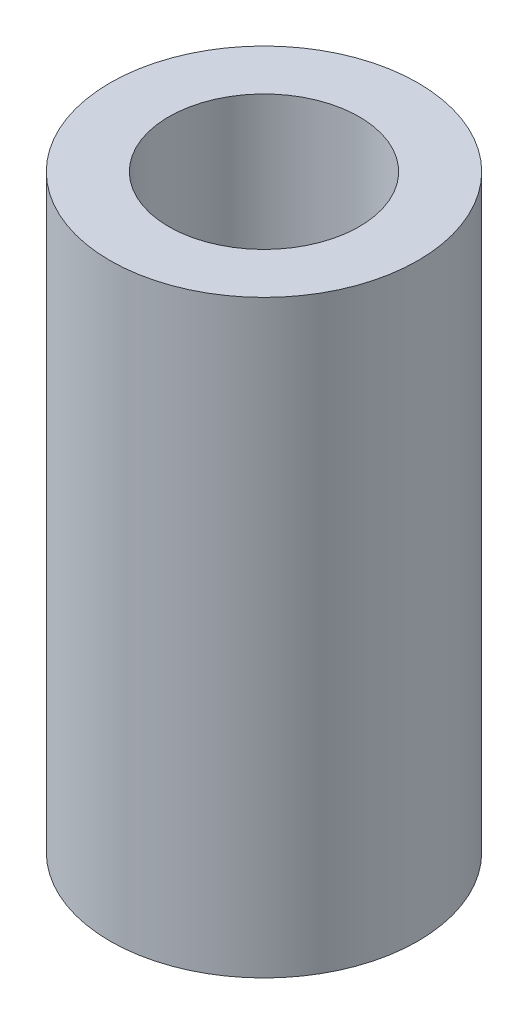
ISO-10303-21;
HEADER;
FILE_DESCRIPTION(('STEP AP214'),'2;1');
FILE_NAME('part.step','',(''),(''),'','','');
FILE_SCHEMA(('AUTOMOTIVE_DESIGN { 1 0 10303 214 1 1 1 1 }'));
ENDSEC;
DATA;
#1=APPLICATION_CONTEXT('core data for automotive mechanical design processes');
#2=APPLICATION_PROTOCOL_DEFINITION('international standard','automotive_design',2000,#1);
#3=PRODUCT_CONTEXT('',#1,'mechanical');
#4=PRODUCT('Part','Part','',(#3));
#5=PRODUCT_RELATED_PRODUCT_CATEGORY('part','',(#4));
#6=PRODUCT_DEFINITION_FORMATION('','',#4);
#7=PRODUCT_DEFINITION_CONTEXT('part definition',#1,'design');
#8=PRODUCT_DEFINITION('design','',#6,#7);
#9=PRODUCT_DEFINITION_SHAPE('','',#8);
#10=(LENGTH_UNIT() NAMED_UNIT(*) SI_UNIT(.MILLI.,.METRE.));
#11=(NAMED_UNIT(*) PLANE_ANGLE_UNIT() SI_UNIT($,.RADIAN.));
#12=(NAMED_UNIT(*) SI_UNIT($,.STERADIAN.) SOLID_ANGLE_UNIT());
#13=UNCERTAINTY_MEASURE_WITH_UNIT(LENGTH_MEASURE(1.E-05),#10,'distance_accuracy_value','');
#14=(GEOMETRIC_REPRESENTATION_CONTEXT(3) GLOBAL_UNCERTAINTY_ASSIGNED_CONTEXT((#13)) GLOBAL_UNIT_ASSIGNED_CONTEXT((#10,
#11,#12)) REPRESENTATION_CONTEXT('',''));
#15=CARTESIAN_POINT('',(0.,0.,0.));
#16=DIRECTION('',(0.,0.,1.));
#17=DIRECTION('',(1.,0.,0.));
#18=AXIS2_PLACEMENT_3D('',#15,#16,#17);
#19=CARTESIAN_POINT('',(0.,17.018,0.));
#20=DIRECTION('',(0.,-1.,0.));
#21=DIRECTION('',(0.,0.,-1.));
#22=AXIS2_PLACEMENT_3D('',#19,#20,#21);
#23=CYLINDRICAL_SURFACE('',#22,4.445);
#24=CARTESIAN_POINT('',(0.,17.018,0.));
#25=DIRECTION('',(0.,1.,0.));
#26=DIRECTION('',(0.,0.,1.));
#27=AXIS2_PLACEMENT_3D('',#24,#25,#26);
#28=CIRCLE('',#27,4.445);
#29=CARTESIAN_POINT('',(0.,17.018,4.445));
#30=VERTEX_POINT('',#29);
#31=EDGE_CURVE('E10',#30,#30,#28,.T.);
#32=ORIENTED_EDGE('',*,*,#31,.F.);
#33=EDGE_LOOP('',(#32));
#34=FACE_BOUND('',#33,.T.);
#35=CARTESIAN_POINT('',(0.,0.,0.));
#36=DIRECTION('',(0.,1.,0.));
#37=DIRECTION('',(0.,0.,1.));
#38=AXIS2_PLACEMENT_3D('',#35,#36,#37);
#39=CIRCLE('',#38,4.445);
#40=CARTESIAN_POINT('',(0.,0.,4.445));
#41=VERTEX_POINT('',#40);
#42=EDGE_CURVE('E48',#41,#41,#39,.T.);
#43=ORIENTED_EDGE('',*,*,#42,.T.);
#44=EDGE_LOOP('',(#43));
#45=FACE_BOUND('',#44,.T.);
#46=ADVANCED_FACE('F45',(#34,#45),#23,.T.);
#47=CARTESIAN_POINT('',(0.,17.018,0.));
#48=DIRECTION('',(0.,1.,0.));
#49=DIRECTION('',(0.,0.,1.));
#50=AXIS2_PLACEMENT_3D('',#47,#48,#49);
#51=PLANE('',#50);
#52=CARTESIAN_POINT('',(0.,17.018,0.));
#53=DIRECTION('',(0.,1.,0.));
#54=DIRECTION('',(0.,0.,1.));
#55=AXIS2_PLACEMENT_3D('',#52,#53,#54);
#56=CIRCLE('',#55,2.75);
#57=CARTESIAN_POINT('',(0.,17.018,2.75));
#58=VERTEX_POINT('',#57);
#59=EDGE_CURVE('E57',#58,#58,#56,.T.);
#60=ORIENTED_EDGE('',*,*,#59,.F.);
#61=EDGE_LOOP('',(#60));
#62=FACE_BOUND('',#61,.T.);
#63=ORIENTED_EDGE('',*,*,#31,.T.);
#64=EDGE_LOOP('',(#63));
#65=FACE_BOUND('',#64,.T.);
#66=ADVANCED_FACE('F70',(#62,#65),#51,.T.);
#67=CARTESIAN_POINT('',(0.,0.,0.));
#68=DIRECTION('',(0.,1.,0.));
#69=DIRECTION('',(0.,0.,1.));
#70=AXIS2_PLACEMENT_3D('',#67,#68,#69);
#71=PLANE('',#70);
#72=CARTESIAN_POINT('',(0.,0.,0.));
#73=DIRECTION('',(0.,1.,0.));
#74=DIRECTION('',(0.,0.,1.));
#75=AXIS2_PLACEMENT_3D('',#72,#73,#74);
#76=CIRCLE('',#75,2.75);
#77=CARTESIAN_POINT('',(0.,0.,2.75));
#78=VERTEX_POINT('',#77);
#79=EDGE_CURVE('E59',#78,#78,#76,.T.);
#80=ORIENTED_EDGE('',*,*,#79,.T.);
#81=EDGE_LOOP('',(#80));
#82=FACE_BOUND('',#81,.T.);
#83=ORIENTED_EDGE('',*,*,#42,.F.);
#84=EDGE_LOOP('',(#83));
#85=FACE_BOUND('',#84,.T.);
#86=ADVANCED_FACE('F72',(#82,#85),#71,.F.);
#87=CARTESIAN_POINT('',(0.,17.018,0.));
#88=DIRECTION('',(0.,-1.,0.));
#89=DIRECTION('',(0.,0.,-1.));
#90=AXIS2_PLACEMENT_3D('',#87,#88,#89);
#91=CYLINDRICAL_SURFACE('',#90,2.75);
#92=ORIENTED_EDGE('',*,*,#59,.T.);
#93=EDGE_LOOP('',(#92));
#94=FACE_BOUND('',#93,.T.);
#95=ORIENTED_EDGE('',*,*,#79,.F.);
#96=EDGE_LOOP('',(#95));
#97=FACE_BOUND('',#96,.T.);
#98=ADVANCED_FACE('F67',(#94,#97),#91,.F.);
#99=CLOSED_SHELL('',(#46,#66,#86,#98));
#100=MANIFOLD_SOLID_BREP('B2',#99);
#101=ADVANCED_BREP_SHAPE_REPRESENTATION('',(#18,#100),#14);
#102=SHAPE_DEFINITION_REPRESENTATION(#9,#101);
ENDSEC;
END-ISO-10303-21;
